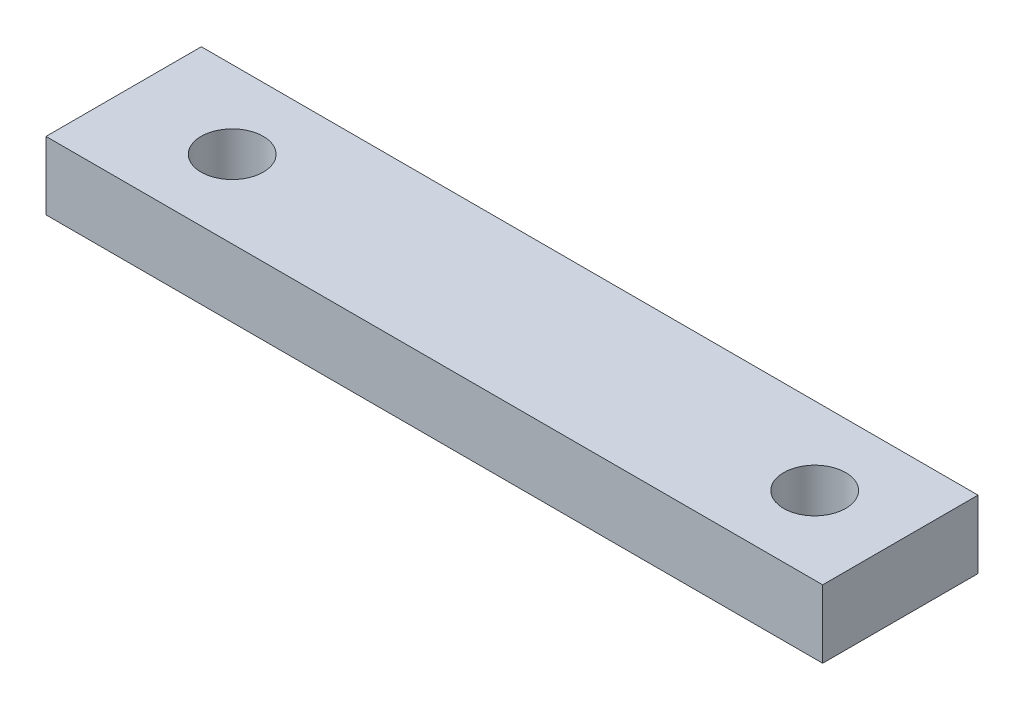
ISO-10303-21;
HEADER;
FILE_DESCRIPTION(('STEP AP214'),'2;1');
FILE_NAME('part.step','',(''),(''),'','','');
FILE_SCHEMA(('AUTOMOTIVE_DESIGN { 1 0 10303 214 1 1 1 1 }'));
ENDSEC;
DATA;
#1=APPLICATION_CONTEXT('core data for automotive mechanical design processes');
#2=APPLICATION_PROTOCOL_DEFINITION('international standard','automotive_design',2000,#1);
#3=PRODUCT_CONTEXT('',#1,'mechanical');
#4=PRODUCT('Part','Part','',(#3));
#5=PRODUCT_RELATED_PRODUCT_CATEGORY('part','',(#4));
#6=PRODUCT_DEFINITION_FORMATION('','',#4);
#7=PRODUCT_DEFINITION_CONTEXT('part definition',#1,'design');
#8=PRODUCT_DEFINITION('design','',#6,#7);
#9=PRODUCT_DEFINITION_SHAPE('','',#8);
#10=(LENGTH_UNIT() NAMED_UNIT(*) SI_UNIT(.MILLI.,.METRE.));
#11=(NAMED_UNIT(*) PLANE_ANGLE_UNIT() SI_UNIT($,.RADIAN.));
#12=(NAMED_UNIT(*) SI_UNIT($,.STERADIAN.) SOLID_ANGLE_UNIT());
#13=UNCERTAINTY_MEASURE_WITH_UNIT(LENGTH_MEASURE(1.E-05),#10,'distance_accuracy_value','');
#14=(GEOMETRIC_REPRESENTATION_CONTEXT(3) GLOBAL_UNCERTAINTY_ASSIGNED_CONTEXT((#13)) GLOBAL_UNIT_ASSIGNED_CONTEXT((#10,
#11,#12)) REPRESENTATION_CONTEXT('',''));
#15=CARTESIAN_POINT('',(0.,0.,0.));
#16=DIRECTION('',(0.,0.,1.));
#17=DIRECTION('',(1.,0.,0.));
#18=AXIS2_PLACEMENT_3D('',#15,#16,#17);
#19=CARTESIAN_POINT('',(-20.,3.5,-4.));
#20=DIRECTION('',(0.,0.,-1.));
#21=DIRECTION('',(-1.,0.,0.));
#22=AXIS2_PLACEMENT_3D('',#19,#20,#21);
#23=PLANE('',#22);
#24=DIRECTION('',(1.,0.,0.));
#25=VECTOR('',#24,1.);
#26=CARTESIAN_POINT('',(-20.,0.,-4.));
#27=LINE('',#26,#25);
#28=CARTESIAN_POINT('',(-20.,0.,-4.));
#29=VERTEX_POINT('',#28);
#30=CARTESIAN_POINT('',(20.,0.,-4.));
#31=VERTEX_POINT('',#30);
#32=EDGE_CURVE('E116',#29,#31,#27,.T.);
#33=ORIENTED_EDGE('',*,*,#32,.F.);
#34=DIRECTION('',(0.,-1.,0.));
#35=VECTOR('',#34,1.);
#36=CARTESIAN_POINT('',(-20.,3.5,-4.));
#37=LINE('',#36,#35);
#38=CARTESIAN_POINT('',(-20.,3.5,-4.));
#39=VERTEX_POINT('',#38);
#40=EDGE_CURVE('E11',#39,#29,#37,.T.);
#41=ORIENTED_EDGE('',*,*,#40,.F.);
#42=DIRECTION('',(1.,0.,0.));
#43=VECTOR('',#42,1.);
#44=CARTESIAN_POINT('',(-20.,3.5,-4.));
#45=LINE('',#44,#43);
#46=CARTESIAN_POINT('',(20.,3.5,-4.));
#47=VERTEX_POINT('',#46);
#48=EDGE_CURVE('E107',#39,#47,#45,.T.);
#49=ORIENTED_EDGE('',*,*,#48,.T.);
#50=DIRECTION('',(0.,-1.,0.));
#51=VECTOR('',#50,1.);
#52=CARTESIAN_POINT('',(20.,3.5,-4.));
#53=LINE('',#52,#51);
#54=EDGE_CURVE('E48',#47,#31,#53,.T.);
#55=ORIENTED_EDGE('',*,*,#54,.T.);
#56=EDGE_LOOP('',(#33,#41,#49,#55));
#57=FACE_BOUND('',#56,.T.);
#58=ADVANCED_FACE('F45',(#57),#23,.T.);
#59=CARTESIAN_POINT('',(-20.,3.5,4.));
#60=DIRECTION('',(-1.,0.,0.));
#61=DIRECTION('',(0.,0.,1.));
#62=AXIS2_PLACEMENT_3D('',#59,#60,#61);
#63=PLANE('',#62);
#64=DIRECTION('',(0.,0.,-1.));
#65=VECTOR('',#64,1.);
#66=CARTESIAN_POINT('',(-20.,0.,4.));
#67=LINE('',#66,#65);
#68=CARTESIAN_POINT('',(-20.,0.,4.));
#69=VERTEX_POINT('',#68);
#70=EDGE_CURVE('E110',#69,#29,#67,.T.);
#71=ORIENTED_EDGE('',*,*,#70,.F.);
#72=DIRECTION('',(0.,-1.,0.));
#73=VECTOR('',#72,1.);
#74=CARTESIAN_POINT('',(-20.,3.5,4.));
#75=LINE('',#74,#73);
#76=CARTESIAN_POINT('',(-20.,3.5,4.));
#77=VERTEX_POINT('',#76);
#78=EDGE_CURVE('E55',#77,#69,#75,.T.);
#79=ORIENTED_EDGE('',*,*,#78,.F.);
#80=DIRECTION('',(0.,0.,-1.));
#81=VECTOR('',#80,1.);
#82=CARTESIAN_POINT('',(-20.,3.5,4.));
#83=LINE('',#82,#81);
#84=EDGE_CURVE('E94',#77,#39,#83,.T.);
#85=ORIENTED_EDGE('',*,*,#84,.T.);
#86=ORIENTED_EDGE('',*,*,#40,.T.);
#87=EDGE_LOOP('',(#71,#79,#85,#86));
#88=FACE_BOUND('',#87,.T.);
#89=ADVANCED_FACE('F133',(#88),#63,.T.);
#90=CARTESIAN_POINT('',(-20.,3.5,4.));
#91=DIRECTION('',(0.,0.,-1.));
#92=DIRECTION('',(-1.,0.,0.));
#93=AXIS2_PLACEMENT_3D('',#90,#91,#92);
#94=PLANE('',#93);
#95=DIRECTION('',(1.,0.,0.));
#96=VECTOR('',#95,1.);
#97=CARTESIAN_POINT('',(-20.,0.,4.));
#98=LINE('',#97,#96);
#99=CARTESIAN_POINT('',(20.,0.,4.));
#100=VERTEX_POINT('',#99);
#101=EDGE_CURVE('E100',#69,#100,#98,.T.);
#102=ORIENTED_EDGE('',*,*,#101,.T.);
#103=DIRECTION('',(0.,-1.,0.));
#104=VECTOR('',#103,1.);
#105=CARTESIAN_POINT('',(20.,3.5,4.));
#106=LINE('',#105,#104);
#107=CARTESIAN_POINT('',(20.,3.5,4.));
#108=VERTEX_POINT('',#107);
#109=EDGE_CURVE('E98',#108,#100,#106,.T.);
#110=ORIENTED_EDGE('',*,*,#109,.F.);
#111=DIRECTION('',(1.,0.,0.));
#112=VECTOR('',#111,1.);
#113=CARTESIAN_POINT('',(-20.,3.5,4.));
#114=LINE('',#113,#112);
#115=EDGE_CURVE('E91',#77,#108,#114,.T.);
#116=ORIENTED_EDGE('',*,*,#115,.F.);
#117=ORIENTED_EDGE('',*,*,#78,.T.);
#118=EDGE_LOOP('',(#102,#110,#116,#117));
#119=FACE_BOUND('',#118,.T.);
#120=ADVANCED_FACE('F99',(#119),#94,.F.);
#121=CARTESIAN_POINT('',(20.,3.5,4.));
#122=DIRECTION('',(-1.,0.,0.));
#123=DIRECTION('',(0.,0.,1.));
#124=AXIS2_PLACEMENT_3D('',#121,#122,#123);
#125=PLANE('',#124);
#126=DIRECTION('',(0.,0.,-1.));
#127=VECTOR('',#126,1.);
#128=CARTESIAN_POINT('',(20.,0.,4.));
#129=LINE('',#128,#127);
#130=EDGE_CURVE('E120',#100,#31,#129,.T.);
#131=ORIENTED_EDGE('',*,*,#130,.T.);
#132=ORIENTED_EDGE('',*,*,#54,.F.);
#133=DIRECTION('',(0.,0.,-1.));
#134=VECTOR('',#133,1.);
#135=CARTESIAN_POINT('',(20.,3.5,4.));
#136=LINE('',#135,#134);
#137=EDGE_CURVE('E88',#108,#47,#136,.T.);
#138=ORIENTED_EDGE('',*,*,#137,.F.);
#139=ORIENTED_EDGE('',*,*,#109,.T.);
#140=EDGE_LOOP('',(#131,#132,#138,#139));
#141=FACE_BOUND('',#140,.T.);
#142=ADVANCED_FACE('F105',(#141),#125,.F.);
#143=CARTESIAN_POINT('',(0.,3.5,0.));
#144=DIRECTION('',(0.,1.,0.));
#145=DIRECTION('',(0.,0.,1.));
#146=AXIS2_PLACEMENT_3D('',#143,#144,#145);
#147=PLANE('',#146);
#148=CARTESIAN_POINT('',(-14.4107660844948,3.5,0.));
#149=DIRECTION('',(0.,-1.,0.));
#150=DIRECTION('',(0.,0.,-1.));
#151=AXIS2_PLACEMENT_3D('',#148,#149,#150);
#152=CIRCLE('',#151,1.6);
#153=CARTESIAN_POINT('',(-14.4107660844948,3.5,-1.6));
#154=VERTEX_POINT('',#153);
#155=EDGE_CURVE('E121',#154,#154,#152,.T.);
#156=ORIENTED_EDGE('',*,*,#155,.T.);
#157=EDGE_LOOP('',(#156));
#158=FACE_BOUND('',#157,.T.);
#159=CARTESIAN_POINT('',(15.5892339155052,3.5,0.));
#160=DIRECTION('',(0.,-1.,0.));
#161=DIRECTION('',(0.,0.,-1.));
#162=AXIS2_PLACEMENT_3D('',#159,#160,#161);
#163=CIRCLE('',#162,1.6);
#164=CARTESIAN_POINT('',(15.5892339155052,3.5,-1.6));
#165=VERTEX_POINT('',#164);
#166=EDGE_CURVE('E176',#165,#165,#163,.T.);
#167=ORIENTED_EDGE('',*,*,#166,.T.);
#168=EDGE_LOOP('',(#167));
#169=FACE_BOUND('',#168,.T.);
#170=ORIENTED_EDGE('',*,*,#48,.F.);
#171=ORIENTED_EDGE('',*,*,#84,.F.);
#172=ORIENTED_EDGE('',*,*,#115,.T.);
#173=ORIENTED_EDGE('',*,*,#137,.T.);
#174=EDGE_LOOP('',(#170,#171,#172,#173));
#175=FACE_BOUND('',#174,.T.);
#176=ADVANCED_FACE('F93',(#158,#169,#175),#147,.T.);
#177=CARTESIAN_POINT('',(0.,0.,0.));
#178=DIRECTION('',(0.,1.,0.));
#179=DIRECTION('',(0.,0.,1.));
#180=AXIS2_PLACEMENT_3D('',#177,#178,#179);
#181=PLANE('',#180);
#182=CARTESIAN_POINT('',(-14.4107660844948,0.,0.));
#183=DIRECTION('',(0.,-1.,0.));
#184=DIRECTION('',(0.,0.,-1.));
#185=AXIS2_PLACEMENT_3D('',#182,#183,#184);
#186=CIRCLE('',#185,1.6);
#187=CARTESIAN_POINT('',(-14.4107660844948,0.,-1.6));
#188=VERTEX_POINT('',#187);
#189=EDGE_CURVE('E168',#188,#188,#186,.T.);
#190=ORIENTED_EDGE('',*,*,#189,.F.);
#191=EDGE_LOOP('',(#190));
#192=FACE_BOUND('',#191,.T.);
#193=CARTESIAN_POINT('',(15.5892339155052,0.,0.));
#194=DIRECTION('',(0.,-1.,0.));
#195=DIRECTION('',(0.,0.,-1.));
#196=AXIS2_PLACEMENT_3D('',#193,#194,#195);
#197=CIRCLE('',#196,1.6);
#198=CARTESIAN_POINT('',(15.5892339155052,0.,-1.6));
#199=VERTEX_POINT('',#198);
#200=EDGE_CURVE('E170',#199,#199,#197,.T.);
#201=ORIENTED_EDGE('',*,*,#200,.F.);
#202=EDGE_LOOP('',(#201));
#203=FACE_BOUND('',#202,.T.);
#204=ORIENTED_EDGE('',*,*,#32,.T.);
#205=ORIENTED_EDGE('',*,*,#130,.F.);
#206=ORIENTED_EDGE('',*,*,#101,.F.);
#207=ORIENTED_EDGE('',*,*,#70,.T.);
#208=EDGE_LOOP('',(#204,#205,#206,#207));
#209=FACE_BOUND('',#208,.T.);
#210=ADVANCED_FACE('F132',(#192,#203,#209),#181,.F.);
#211=CARTESIAN_POINT('',(15.5892339155052,3.5,0.));
#212=DIRECTION('',(0.,-1.,0.));
#213=DIRECTION('',(0.,0.,-1.));
#214=AXIS2_PLACEMENT_3D('',#211,#212,#213);
#215=CYLINDRICAL_SURFACE('',#214,1.6);
#216=ORIENTED_EDGE('',*,*,#166,.F.);
#217=EDGE_LOOP('',(#216));
#218=FACE_BOUND('',#217,.T.);
#219=ORIENTED_EDGE('',*,*,#200,.T.);
#220=EDGE_LOOP('',(#219));
#221=FACE_BOUND('',#220,.T.);
#222=ADVANCED_FACE('F151',(#218,#221),#215,.F.);
#223=CARTESIAN_POINT('',(-14.4107660844948,3.5,0.));
#224=DIRECTION('',(0.,-1.,0.));
#225=DIRECTION('',(0.,0.,-1.));
#226=AXIS2_PLACEMENT_3D('',#223,#224,#225);
#227=CYLINDRICAL_SURFACE('',#226,1.6);
#228=ORIENTED_EDGE('',*,*,#155,.F.);
#229=EDGE_LOOP('',(#228));
#230=FACE_BOUND('',#229,.T.);
#231=ORIENTED_EDGE('',*,*,#189,.T.);
#232=EDGE_LOOP('',(#231));
#233=FACE_BOUND('',#232,.T.);
#234=ADVANCED_FACE('F158',(#230,#233),#227,.F.);
#235=CLOSED_SHELL('',(#58,#89,#120,#142,#176,#210,#222,#234));
#236=MANIFOLD_SOLID_BREP('B2',#235);
#237=ADVANCED_BREP_SHAPE_REPRESENTATION('',(#18,#236),#14);
#238=SHAPE_DEFINITION_REPRESENTATION(#9,#237);
ENDSEC;
END-ISO-10303-21;
